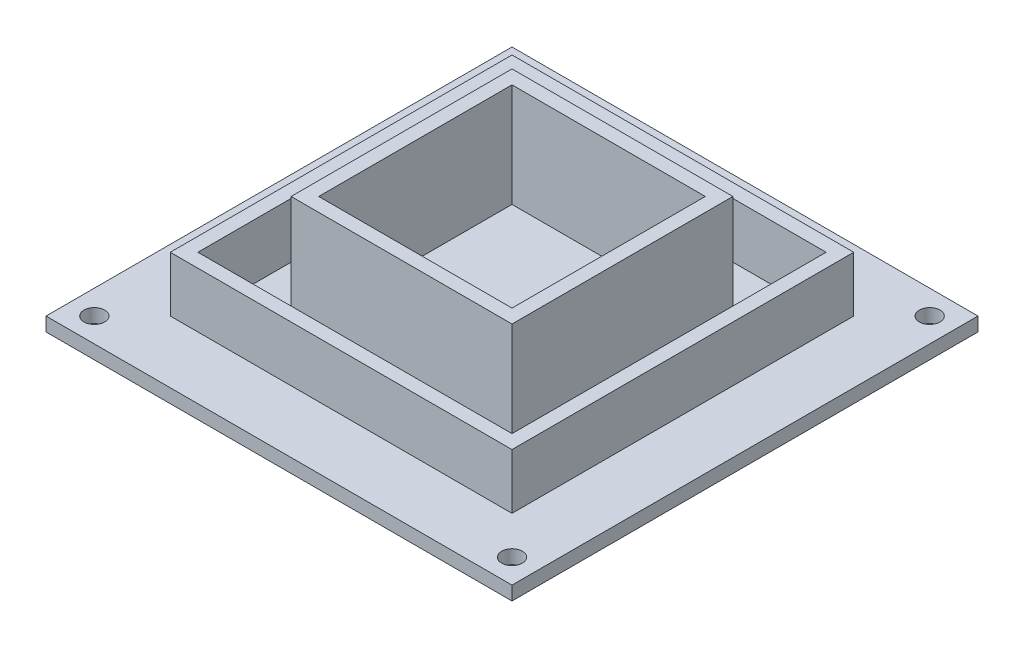
ISO-10303-21;
HEADER;
FILE_DESCRIPTION(('STEP AP214'),'2;1');
FILE_NAME('part.step','',(''),(''),'','','');
FILE_SCHEMA(('AUTOMOTIVE_DESIGN { 1 0 10303 214 1 1 1 1 }'));
ENDSEC;
DATA;
#1=APPLICATION_CONTEXT('core data for automotive mechanical design processes');
#2=APPLICATION_PROTOCOL_DEFINITION('international standard','automotive_design',2000,#1);
#3=PRODUCT_CONTEXT('',#1,'mechanical');
#4=PRODUCT('Part','Part','',(#3));
#5=PRODUCT_RELATED_PRODUCT_CATEGORY('part','',(#4));
#6=PRODUCT_DEFINITION_FORMATION('','',#4);
#7=PRODUCT_DEFINITION_CONTEXT('part definition',#1,'design');
#8=PRODUCT_DEFINITION('design','',#6,#7);
#9=PRODUCT_DEFINITION_SHAPE('','',#8);
#10=(LENGTH_UNIT() NAMED_UNIT(*) SI_UNIT(.MILLI.,.METRE.));
#11=(NAMED_UNIT(*) PLANE_ANGLE_UNIT() SI_UNIT($,.RADIAN.));
#12=(NAMED_UNIT(*) SI_UNIT($,.STERADIAN.) SOLID_ANGLE_UNIT());
#13=UNCERTAINTY_MEASURE_WITH_UNIT(LENGTH_MEASURE(1.E-05),#10,'distance_accuracy_value','');
#14=(GEOMETRIC_REPRESENTATION_CONTEXT(3) GLOBAL_UNCERTAINTY_ASSIGNED_CONTEXT((#13)) GLOBAL_UNIT_ASSIGNED_CONTEXT((#10,
#11,#12)) REPRESENTATION_CONTEXT('',''));
#15=CARTESIAN_POINT('',(0.,0.,0.));
#16=DIRECTION('',(0.,0.,1.));
#17=DIRECTION('',(1.,0.,0.));
#18=AXIS2_PLACEMENT_3D('',#15,#16,#17);
#19=CARTESIAN_POINT('',(0.,2.,0.));
#20=DIRECTION('',(0.,1.,0.));
#21=DIRECTION('',(0.,0.,1.));
#22=AXIS2_PLACEMENT_3D('',#19,#20,#21);
#23=PLANE('',#22);
#24=DIRECTION('',(0.,0.,1.));
#25=VECTOR('',#24,1.);
#26=CARTESIAN_POINT('',(8.69278606965178,2.,0.));
#27=LINE('',#26,#25);
#28=CARTESIAN_POINT('',(8.69278606965177,2.,-5.90671641791045));
#29=VERTEX_POINT('',#28);
#30=CARTESIAN_POINT('',(8.69278606965179,2.,26.0932835820895));
#31=VERTEX_POINT('',#30);
#32=EDGE_CURVE('E279',#29,#31,#27,.T.);
#33=ORIENTED_EDGE('',*,*,#32,.T.);
#34=DIRECTION('',(-1.,0.,0.));
#35=VECTOR('',#34,1.);
#36=CARTESIAN_POINT('',(0.,2.,26.0932835820896));
#37=LINE('',#36,#35);
#38=CARTESIAN_POINT('',(-23.3072139303482,2.,26.0932835820896));
#39=VERTEX_POINT('',#38);
#40=EDGE_CURVE('E281',#31,#39,#37,.T.);
#41=ORIENTED_EDGE('',*,*,#40,.T.);
#42=DIRECTION('',(0.,0.,1.));
#43=VECTOR('',#42,1.);
#44=CARTESIAN_POINT('',(-23.3072139303482,2.,0.));
#45=LINE('',#44,#43);
#46=CARTESIAN_POINT('',(-23.3072139303482,2.,-5.90671641791043));
#47=VERTEX_POINT('',#46);
#48=EDGE_CURVE('E254',#47,#39,#45,.T.);
#49=ORIENTED_EDGE('',*,*,#48,.F.);
#50=DIRECTION('',(-1.,0.,0.));
#51=VECTOR('',#50,1.);
#52=CARTESIAN_POINT('',(0.,2.,-5.90671641791045));
#53=LINE('',#52,#51);
#54=EDGE_CURVE('E276',#29,#47,#53,.T.);
#55=ORIENTED_EDGE('',*,*,#54,.F.);
#56=EDGE_LOOP('',(#33,#41,#49,#55));
#57=FACE_BOUND('',#56,.T.);
#58=DIRECTION('',(0.,0.,1.));
#59=VECTOR('',#58,1.);
#60=CARTESIAN_POINT('',(-30.0572139303482,2.,0.));
#61=LINE('',#60,#59);
#62=CARTESIAN_POINT('',(-30.0572139303482,2.,-12.6567164179104));
#63=VERTEX_POINT('',#62);
#64=CARTESIAN_POINT('',(-30.0572139303482,2.,32.8432835820896));
#65=VERTEX_POINT('',#64);
#66=EDGE_CURVE('E50',#63,#65,#61,.T.);
#67=ORIENTED_EDGE('',*,*,#66,.T.);
#68=DIRECTION('',(1.,0.,0.));
#69=VECTOR('',#68,1.);
#70=CARTESIAN_POINT('',(0.,2.,32.8432835820895));
#71=LINE('',#70,#69);
#72=CARTESIAN_POINT('',(15.4427860696518,2.,32.8432835820895));
#73=VERTEX_POINT('',#72);
#74=EDGE_CURVE('E192',#65,#73,#71,.T.);
#75=ORIENTED_EDGE('',*,*,#74,.T.);
#76=DIRECTION('',(0.,0.,1.));
#77=VECTOR('',#76,1.);
#78=CARTESIAN_POINT('',(15.4427860696518,2.,0.));
#79=LINE('',#78,#77);
#80=CARTESIAN_POINT('',(15.4427860696518,2.,-12.6567164179104));
#81=VERTEX_POINT('',#80);
#82=EDGE_CURVE('E205',#81,#73,#79,.T.);
#83=ORIENTED_EDGE('',*,*,#82,.F.);
#84=DIRECTION('',(1.,0.,0.));
#85=VECTOR('',#84,1.);
#86=CARTESIAN_POINT('',(0.,2.,-12.6567164179104));
#87=LINE('',#86,#85);
#88=EDGE_CURVE('E55',#63,#81,#87,.T.);
#89=ORIENTED_EDGE('',*,*,#88,.F.);
#90=EDGE_LOOP('',(#67,#75,#83,#89));
#91=FACE_BOUND('',#90,.T.);
#92=ADVANCED_FACE('F35',(#57,#91),#23,.T.);
#93=CARTESIAN_POINT('',(0.,17.,26.0932835820896));
#94=DIRECTION('',(0.,0.,-1.));
#95=DIRECTION('',(-1.,0.,0.));
#96=AXIS2_PLACEMENT_3D('',#93,#94,#95);
#97=PLANE('',#96);
#98=ORIENTED_EDGE('',*,*,#40,.F.);
#99=DIRECTION('',(0.,-1.,0.));
#100=VECTOR('',#99,1.);
#101=CARTESIAN_POINT('',(8.69278606965179,17.,26.0932835820895));
#102=LINE('',#101,#100);
#103=CARTESIAN_POINT('',(8.69278606965179,17.,26.0932835820895));
#104=VERTEX_POINT('',#103);
#105=EDGE_CURVE('E251',#104,#31,#102,.T.);
#106=ORIENTED_EDGE('',*,*,#105,.F.);
#107=DIRECTION('',(1.,0.,0.));
#108=VECTOR('',#107,1.);
#109=CARTESIAN_POINT('',(0.,17.,26.0932835820896));
#110=LINE('',#109,#108);
#111=CARTESIAN_POINT('',(-23.3072139303482,17.,26.0932835820896));
#112=VERTEX_POINT('',#111);
#113=EDGE_CURVE('E229',#112,#104,#110,.T.);
#114=ORIENTED_EDGE('',*,*,#113,.F.);
#115=DIRECTION('',(0.,-1.,0.));
#116=VECTOR('',#115,1.);
#117=CARTESIAN_POINT('',(-23.3072139303482,17.,26.0932835820896));
#118=LINE('',#117,#116);
#119=EDGE_CURVE('E241',#112,#39,#118,.T.);
#120=ORIENTED_EDGE('',*,*,#119,.T.);
#121=EDGE_LOOP('',(#98,#106,#114,#120));
#122=FACE_BOUND('',#121,.T.);
#123=ADVANCED_FACE('F417',(#122),#97,.F.);
#124=CARTESIAN_POINT('',(8.69278606965178,17.,0.));
#125=DIRECTION('',(-1.,0.,0.));
#126=DIRECTION('',(0.,0.,1.));
#127=AXIS2_PLACEMENT_3D('',#124,#125,#126);
#128=PLANE('',#127);
#129=ORIENTED_EDGE('',*,*,#32,.F.);
#130=DIRECTION('',(0.,-1.,0.));
#131=VECTOR('',#130,1.);
#132=CARTESIAN_POINT('',(8.69278606965177,17.,-5.90671641791045));
#133=LINE('',#132,#131);
#134=CARTESIAN_POINT('',(8.69278606965177,17.,-5.90671641791045));
#135=VERTEX_POINT('',#134);
#136=EDGE_CURVE('E248',#135,#29,#133,.T.);
#137=ORIENTED_EDGE('',*,*,#136,.F.);
#138=DIRECTION('',(0.,0.,-1.));
#139=VECTOR('',#138,1.);
#140=CARTESIAN_POINT('',(8.69278606965178,17.,0.));
#141=LINE('',#140,#139);
#142=EDGE_CURVE('E232',#104,#135,#141,.T.);
#143=ORIENTED_EDGE('',*,*,#142,.F.);
#144=ORIENTED_EDGE('',*,*,#105,.T.);
#145=EDGE_LOOP('',(#129,#137,#143,#144));
#146=FACE_BOUND('',#145,.T.);
#147=ADVANCED_FACE('F422',(#146),#128,.F.);
#148=CARTESIAN_POINT('',(0.,17.,-5.90671641791045));
#149=DIRECTION('',(0.,0.,-1.));
#150=DIRECTION('',(-1.,0.,0.));
#151=AXIS2_PLACEMENT_3D('',#148,#149,#150);
#152=PLANE('',#151);
#153=ORIENTED_EDGE('',*,*,#136,.T.);
#154=ORIENTED_EDGE('',*,*,#54,.T.);
#155=DIRECTION('',(0.,-1.,0.));
#156=VECTOR('',#155,1.);
#157=CARTESIAN_POINT('',(-23.3072139303482,17.,-5.90671641791043));
#158=LINE('',#157,#156);
#159=CARTESIAN_POINT('',(-23.3072139303482,17.,-5.90671641791043));
#160=VERTEX_POINT('',#159);
#161=EDGE_CURVE('E244',#160,#47,#158,.T.);
#162=ORIENTED_EDGE('',*,*,#161,.F.);
#163=DIRECTION('',(1.,0.,0.));
#164=VECTOR('',#163,1.);
#165=CARTESIAN_POINT('',(0.,17.,-5.90671641791045));
#166=LINE('',#165,#164);
#167=EDGE_CURVE('E234',#160,#135,#166,.T.);
#168=ORIENTED_EDGE('',*,*,#167,.T.);
#169=EDGE_LOOP('',(#153,#154,#162,#168));
#170=FACE_BOUND('',#169,.T.);
#171=ADVANCED_FACE('F464',(#170),#152,.T.);
#172=CARTESIAN_POINT('',(6.69278606965177,17.,0.));
#173=DIRECTION('',(-1.,0.,0.));
#174=DIRECTION('',(0.,0.,1.));
#175=AXIS2_PLACEMENT_3D('',#172,#173,#174);
#176=PLANE('',#175);
#177=DIRECTION('',(0.,-1.,0.));
#178=VECTOR('',#177,1.);
#179=CARTESIAN_POINT('',(6.69278606965177,17.,-3.90671641791045));
#180=LINE('',#179,#178);
#181=CARTESIAN_POINT('',(6.69278606965177,17.,-3.90671641791045));
#182=VERTEX_POINT('',#181);
#183=CARTESIAN_POINT('',(6.69278606965177,2.,-3.90671641791045));
#184=VERTEX_POINT('',#183);
#185=EDGE_CURVE('E240',#182,#184,#180,.T.);
#186=ORIENTED_EDGE('',*,*,#185,.T.);
#187=DIRECTION('',(0.,0.,1.));
#188=VECTOR('',#187,1.);
#189=CARTESIAN_POINT('',(6.69278606965177,2.,0.));
#190=LINE('',#189,#188);
#191=CARTESIAN_POINT('',(6.69278606965177,2.,24.0932835820896));
#192=VERTEX_POINT('',#191);
#193=EDGE_CURVE('E274',#184,#192,#190,.T.);
#194=ORIENTED_EDGE('',*,*,#193,.T.);
#195=DIRECTION('',(0.,-1.,0.));
#196=VECTOR('',#195,1.);
#197=CARTESIAN_POINT('',(6.69278606965177,17.,24.0932835820896));
#198=LINE('',#197,#196);
#199=CARTESIAN_POINT('',(6.69278606965177,17.,24.0932835820896));
#200=VERTEX_POINT('',#199);
#201=EDGE_CURVE('E245',#200,#192,#198,.T.);
#202=ORIENTED_EDGE('',*,*,#201,.F.);
#203=DIRECTION('',(0.,0.,-1.));
#204=VECTOR('',#203,1.);
#205=CARTESIAN_POINT('',(6.69278606965177,17.,0.));
#206=LINE('',#205,#204);
#207=EDGE_CURVE('E219',#200,#182,#206,.T.);
#208=ORIENTED_EDGE('',*,*,#207,.T.);
#209=EDGE_LOOP('',(#186,#194,#202,#208));
#210=FACE_BOUND('',#209,.T.);
#211=ADVANCED_FACE('F440',(#210),#176,.T.);
#212=CARTESIAN_POINT('',(0.,17.,24.0932835820896));
#213=DIRECTION('',(0.,0.,-1.));
#214=DIRECTION('',(-1.,0.,0.));
#215=AXIS2_PLACEMENT_3D('',#212,#213,#214);
#216=PLANE('',#215);
#217=ORIENTED_EDGE('',*,*,#201,.T.);
#218=DIRECTION('',(-1.,0.,0.));
#219=VECTOR('',#218,1.);
#220=CARTESIAN_POINT('',(0.,2.,24.0932835820896));
#221=LINE('',#220,#219);
#222=CARTESIAN_POINT('',(-21.3072139303482,2.,24.0932835820896));
#223=VERTEX_POINT('',#222);
#224=EDGE_CURVE('E272',#192,#223,#221,.T.);
#225=ORIENTED_EDGE('',*,*,#224,.T.);
#226=DIRECTION('',(0.,-1.,0.));
#227=VECTOR('',#226,1.);
#228=CARTESIAN_POINT('',(-21.3072139303482,17.,24.0932835820896));
#229=LINE('',#228,#227);
#230=CARTESIAN_POINT('',(-21.3072139303482,17.,24.0932835820896));
#231=VERTEX_POINT('',#230);
#232=EDGE_CURVE('E259',#231,#223,#229,.T.);
#233=ORIENTED_EDGE('',*,*,#232,.F.);
#234=DIRECTION('',(1.,0.,0.));
#235=VECTOR('',#234,1.);
#236=CARTESIAN_POINT('',(0.,17.,24.0932835820896));
#237=LINE('',#236,#235);
#238=EDGE_CURVE('E222',#231,#200,#237,.T.);
#239=ORIENTED_EDGE('',*,*,#238,.T.);
#240=EDGE_LOOP('',(#217,#225,#233,#239));
#241=FACE_BOUND('',#240,.T.);
#242=ADVANCED_FACE('F444',(#241),#216,.T.);
#243=CARTESIAN_POINT('',(-21.3072139303482,17.,0.));
#244=DIRECTION('',(-1.,0.,0.));
#245=DIRECTION('',(0.,0.,1.));
#246=AXIS2_PLACEMENT_3D('',#243,#244,#245);
#247=PLANE('',#246);
#248=DIRECTION('',(0.,0.,1.));
#249=VECTOR('',#248,1.);
#250=CARTESIAN_POINT('',(-21.3072139303482,2.,0.));
#251=LINE('',#250,#249);
#252=CARTESIAN_POINT('',(-21.3072139303482,2.,-3.90671641791045));
#253=VERTEX_POINT('',#252);
#254=EDGE_CURVE('E269',#253,#223,#251,.T.);
#255=ORIENTED_EDGE('',*,*,#254,.F.);
#256=DIRECTION('',(0.,-1.,0.));
#257=VECTOR('',#256,1.);
#258=CARTESIAN_POINT('',(-21.3072139303482,17.,-3.90671641791045));
#259=LINE('',#258,#257);
#260=CARTESIAN_POINT('',(-21.3072139303482,17.,-3.90671641791045));
#261=VERTEX_POINT('',#260);
#262=EDGE_CURVE('E257',#261,#253,#259,.T.);
#263=ORIENTED_EDGE('',*,*,#262,.F.);
#264=DIRECTION('',(0.,0.,-1.));
#265=VECTOR('',#264,1.);
#266=CARTESIAN_POINT('',(-21.3072139303482,17.,0.));
#267=LINE('',#266,#265);
#268=EDGE_CURVE('E225',#231,#261,#267,.T.);
#269=ORIENTED_EDGE('',*,*,#268,.F.);
#270=ORIENTED_EDGE('',*,*,#232,.T.);
#271=EDGE_LOOP('',(#255,#263,#269,#270));
#272=FACE_BOUND('',#271,.T.);
#273=ADVANCED_FACE('F454',(#272),#247,.F.);
#274=CARTESIAN_POINT('',(0.,17.,-3.90671641791045));
#275=DIRECTION('',(0.,0.,-1.));
#276=DIRECTION('',(-1.,0.,0.));
#277=AXIS2_PLACEMENT_3D('',#274,#275,#276);
#278=PLANE('',#277);
#279=DIRECTION('',(-1.,0.,0.));
#280=VECTOR('',#279,1.);
#281=CARTESIAN_POINT('',(0.,2.,-3.90671641791045));
#282=LINE('',#281,#280);
#283=EDGE_CURVE('E266',#184,#253,#282,.T.);
#284=ORIENTED_EDGE('',*,*,#283,.F.);
#285=ORIENTED_EDGE('',*,*,#185,.F.);
#286=DIRECTION('',(1.,0.,0.));
#287=VECTOR('',#286,1.);
#288=CARTESIAN_POINT('',(0.,17.,-3.90671641791045));
#289=LINE('',#288,#287);
#290=EDGE_CURVE('E227',#261,#182,#289,.T.);
#291=ORIENTED_EDGE('',*,*,#290,.F.);
#292=ORIENTED_EDGE('',*,*,#262,.T.);
#293=EDGE_LOOP('',(#284,#285,#291,#292));
#294=FACE_BOUND('',#293,.T.);
#295=ADVANCED_FACE('F451',(#294),#278,.F.);
#296=CARTESIAN_POINT('',(-23.3072139303482,17.,0.));
#297=DIRECTION('',(-1.,0.,0.));
#298=DIRECTION('',(0.,0.,1.));
#299=AXIS2_PLACEMENT_3D('',#296,#297,#298);
#300=PLANE('',#299);
#301=ORIENTED_EDGE('',*,*,#161,.T.);
#302=ORIENTED_EDGE('',*,*,#48,.T.);
#303=ORIENTED_EDGE('',*,*,#119,.F.);
#304=DIRECTION('',(0.,0.,-1.));
#305=VECTOR('',#304,1.);
#306=CARTESIAN_POINT('',(-23.3072139303482,17.,0.));
#307=LINE('',#306,#305);
#308=EDGE_CURVE('E237',#112,#160,#307,.T.);
#309=ORIENTED_EDGE('',*,*,#308,.T.);
#310=EDGE_LOOP('',(#301,#302,#303,#309));
#311=FACE_BOUND('',#310,.T.);
#312=ADVANCED_FACE('F434',(#311),#300,.T.);
#313=CARTESIAN_POINT('',(0.,17.,0.));
#314=DIRECTION('',(0.,1.,0.));
#315=DIRECTION('',(0.,0.,1.));
#316=AXIS2_PLACEMENT_3D('',#313,#314,#315);
#317=PLANE('',#316);
#318=ORIENTED_EDGE('',*,*,#207,.F.);
#319=ORIENTED_EDGE('',*,*,#238,.F.);
#320=ORIENTED_EDGE('',*,*,#268,.T.);
#321=ORIENTED_EDGE('',*,*,#290,.T.);
#322=EDGE_LOOP('',(#318,#319,#320,#321));
#323=FACE_BOUND('',#322,.T.);
#324=ORIENTED_EDGE('',*,*,#113,.T.);
#325=ORIENTED_EDGE('',*,*,#142,.T.);
#326=ORIENTED_EDGE('',*,*,#167,.F.);
#327=ORIENTED_EDGE('',*,*,#308,.F.);
#328=EDGE_LOOP('',(#324,#325,#326,#327));
#329=FACE_BOUND('',#328,.T.);
#330=ADVANCED_FACE('F427',(#323,#329),#317,.T.);
#331=ORIENTED_EDGE('',*,*,#193,.F.);
#332=ORIENTED_EDGE('',*,*,#283,.T.);
#333=ORIENTED_EDGE('',*,*,#254,.T.);
#334=ORIENTED_EDGE('',*,*,#224,.F.);
#335=EDGE_LOOP('',(#331,#332,#333,#334));
#336=FACE_BOUND('',#335,.T.);
#337=ADVANCED_FACE('F360',(#336),#23,.T.);
#338=CARTESIAN_POINT('',(0.,10.,34.8432835820896));
#339=DIRECTION('',(0.,0.,-1.));
#340=DIRECTION('',(-1.,0.,0.));
#341=AXIS2_PLACEMENT_3D('',#338,#339,#340);
#342=PLANE('',#341);
#343=DIRECTION('',(-1.,0.,0.));
#344=VECTOR('',#343,1.);
#345=CARTESIAN_POINT('',(0.,2.,34.8432835820896));
#346=LINE('',#345,#344);
#347=CARTESIAN_POINT('',(17.4427860696518,2.,34.8432835820896));
#348=VERTEX_POINT('',#347);
#349=CARTESIAN_POINT('',(-32.0572139303482,2.,34.8432835820896));
#350=VERTEX_POINT('',#349);
#351=EDGE_CURVE('E217',#348,#350,#346,.T.);
#352=ORIENTED_EDGE('',*,*,#351,.F.);
#353=DIRECTION('',(0.,-1.,0.));
#354=VECTOR('',#353,1.);
#355=CARTESIAN_POINT('',(17.4427860696518,10.,34.8432835820896));
#356=LINE('',#355,#354);
#357=CARTESIAN_POINT('',(17.4427860696518,10.,34.8432835820896));
#358=VERTEX_POINT('',#357);
#359=EDGE_CURVE('E206',#358,#348,#356,.T.);
#360=ORIENTED_EDGE('',*,*,#359,.F.);
#361=DIRECTION('',(1.,0.,0.));
#362=VECTOR('',#361,1.);
#363=CARTESIAN_POINT('',(0.,10.,34.8432835820896));
#364=LINE('',#363,#362);
#365=CARTESIAN_POINT('',(-32.0572139303482,10.,34.8432835820896));
#366=VERTEX_POINT('',#365);
#367=EDGE_CURVE('E391',#366,#358,#364,.T.);
#368=ORIENTED_EDGE('',*,*,#367,.F.);
#369=DIRECTION('',(0.,-1.,0.));
#370=VECTOR('',#369,1.);
#371=CARTESIAN_POINT('',(-32.0572139303482,10.,34.8432835820896));
#372=LINE('',#371,#370);
#373=EDGE_CURVE('E193',#366,#350,#372,.T.);
#374=ORIENTED_EDGE('',*,*,#373,.T.);
#375=EDGE_LOOP('',(#352,#360,#368,#374));
#376=FACE_BOUND('',#375,.T.);
#377=ADVANCED_FACE('F373',(#376),#342,.F.);
#378=CARTESIAN_POINT('',(17.4427860696518,10.,0.));
#379=DIRECTION('',(-1.,0.,0.));
#380=DIRECTION('',(0.,0.,1.));
#381=AXIS2_PLACEMENT_3D('',#378,#379,#380);
#382=PLANE('',#381);
#383=DIRECTION('',(0.,0.,1.));
#384=VECTOR('',#383,1.);
#385=CARTESIAN_POINT('',(17.4427860696518,2.,0.));
#386=LINE('',#385,#384);
#387=CARTESIAN_POINT('',(17.4427860696518,2.,-14.6567164179105));
#388=VERTEX_POINT('',#387);
#389=EDGE_CURVE('E215',#388,#348,#386,.T.);
#390=ORIENTED_EDGE('',*,*,#389,.F.);
#391=DIRECTION('',(0.,-1.,0.));
#392=VECTOR('',#391,1.);
#393=CARTESIAN_POINT('',(17.4427860696518,10.,-14.6567164179105));
#394=LINE('',#393,#392);
#395=CARTESIAN_POINT('',(17.4427860696518,10.,-14.6567164179105));
#396=VERTEX_POINT('',#395);
#397=EDGE_CURVE('E378',#396,#388,#394,.T.);
#398=ORIENTED_EDGE('',*,*,#397,.F.);
#399=DIRECTION('',(0.,0.,-1.));
#400=VECTOR('',#399,1.);
#401=CARTESIAN_POINT('',(17.4427860696518,10.,0.));
#402=LINE('',#401,#400);
#403=EDGE_CURVE('E376',#358,#396,#402,.T.);
#404=ORIENTED_EDGE('',*,*,#403,.F.);
#405=ORIENTED_EDGE('',*,*,#359,.T.);
#406=EDGE_LOOP('',(#390,#398,#404,#405));
#407=FACE_BOUND('',#406,.T.);
#408=ADVANCED_FACE('F375',(#407),#382,.F.);
#409=CARTESIAN_POINT('',(0.,10.,-14.6567164179105));
#410=DIRECTION('',(0.,0.,-1.));
#411=DIRECTION('',(-1.,0.,0.));
#412=AXIS2_PLACEMENT_3D('',#409,#410,#411);
#413=PLANE('',#412);
#414=ORIENTED_EDGE('',*,*,#397,.T.);
#415=DIRECTION('',(-1.,0.,0.));
#416=VECTOR('',#415,1.);
#417=CARTESIAN_POINT('',(0.,2.,-14.6567164179105));
#418=LINE('',#417,#416);
#419=CARTESIAN_POINT('',(-32.0572139303482,2.,-14.6567164179105));
#420=VERTEX_POINT('',#419);
#421=EDGE_CURVE('E212',#388,#420,#418,.T.);
#422=ORIENTED_EDGE('',*,*,#421,.T.);
#423=DIRECTION('',(0.,-1.,0.));
#424=VECTOR('',#423,1.);
#425=CARTESIAN_POINT('',(-32.0572139303482,10.,-14.6567164179105));
#426=LINE('',#425,#424);
#427=CARTESIAN_POINT('',(-32.0572139303482,10.,-14.6567164179105));
#428=VERTEX_POINT('',#427);
#429=EDGE_CURVE('E196',#428,#420,#426,.T.);
#430=ORIENTED_EDGE('',*,*,#429,.F.);
#431=DIRECTION('',(1.,0.,0.));
#432=VECTOR('',#431,1.);
#433=CARTESIAN_POINT('',(0.,10.,-14.6567164179105));
#434=LINE('',#433,#432);
#435=EDGE_CURVE('E396',#428,#396,#434,.T.);
#436=ORIENTED_EDGE('',*,*,#435,.T.);
#437=EDGE_LOOP('',(#414,#422,#430,#436));
#438=FACE_BOUND('',#437,.T.);
#439=ADVANCED_FACE('F406',(#438),#413,.T.);
#440=CARTESIAN_POINT('',(0.,10.,32.8432835820895));
#441=DIRECTION('',(0.,0.,1.));
#442=DIRECTION('',(1.,0.,0.));
#443=AXIS2_PLACEMENT_3D('',#440,#441,#442);
#444=PLANE('',#443);
#445=ORIENTED_EDGE('',*,*,#74,.F.);
#446=DIRECTION('',(0.,-1.,0.));
#447=VECTOR('',#446,1.);
#448=CARTESIAN_POINT('',(-30.0572139303482,10.,32.8432835820896));
#449=LINE('',#448,#447);
#450=CARTESIAN_POINT('',(-30.0572139303482,10.,32.8432835820896));
#451=VERTEX_POINT('',#450);
#452=EDGE_CURVE('E173',#451,#65,#449,.T.);
#453=ORIENTED_EDGE('',*,*,#452,.F.);
#454=DIRECTION('',(-1.,0.,0.));
#455=VECTOR('',#454,1.);
#456=CARTESIAN_POINT('',(0.,10.,32.8432835820895));
#457=LINE('',#456,#455);
#458=CARTESIAN_POINT('',(15.4427860696518,10.,32.8432835820895));
#459=VERTEX_POINT('',#458);
#460=EDGE_CURVE('E180',#459,#451,#457,.T.);
#461=ORIENTED_EDGE('',*,*,#460,.F.);
#462=DIRECTION('',(0.,-1.,0.));
#463=VECTOR('',#462,1.);
#464=CARTESIAN_POINT('',(15.4427860696518,10.,32.8432835820895));
#465=LINE('',#464,#463);
#466=EDGE_CURVE('E383',#459,#73,#465,.T.);
#467=ORIENTED_EDGE('',*,*,#466,.T.);
#468=EDGE_LOOP('',(#445,#453,#461,#467));
#469=FACE_BOUND('',#468,.T.);
#470=ADVANCED_FACE('F191',(#469),#444,.F.);
#471=CARTESIAN_POINT('',(-30.0572139303482,10.,0.));
#472=DIRECTION('',(-1.,0.,0.));
#473=DIRECTION('',(0.,0.,1.));
#474=AXIS2_PLACEMENT_3D('',#471,#472,#473);
#475=PLANE('',#474);
#476=ORIENTED_EDGE('',*,*,#66,.F.);
#477=DIRECTION('',(0.,-1.,0.));
#478=VECTOR('',#477,1.);
#479=CARTESIAN_POINT('',(-30.0572139303482,10.,-12.6567164179104));
#480=LINE('',#479,#478);
#481=CARTESIAN_POINT('',(-30.0572139303482,10.,-12.6567164179104));
#482=VERTEX_POINT('',#481);
#483=EDGE_CURVE('E175',#482,#63,#480,.T.);
#484=ORIENTED_EDGE('',*,*,#483,.F.);
#485=DIRECTION('',(0.,0.,-1.));
#486=VECTOR('',#485,1.);
#487=CARTESIAN_POINT('',(-30.0572139303482,10.,0.));
#488=LINE('',#487,#486);
#489=EDGE_CURVE('E169',#451,#482,#488,.T.);
#490=ORIENTED_EDGE('',*,*,#489,.F.);
#491=ORIENTED_EDGE('',*,*,#452,.T.);
#492=EDGE_LOOP('',(#476,#484,#490,#491));
#493=FACE_BOUND('',#492,.T.);
#494=ADVANCED_FACE('F171',(#493),#475,.F.);
#495=CARTESIAN_POINT('',(0.,10.,-12.6567164179104));
#496=DIRECTION('',(0.,0.,1.));
#497=DIRECTION('',(1.,0.,0.));
#498=AXIS2_PLACEMENT_3D('',#495,#496,#497);
#499=PLANE('',#498);
#500=ORIENTED_EDGE('',*,*,#483,.T.);
#501=ORIENTED_EDGE('',*,*,#88,.T.);
#502=DIRECTION('',(0.,-1.,0.));
#503=VECTOR('',#502,1.);
#504=CARTESIAN_POINT('',(15.4427860696518,10.,-12.6567164179104));
#505=LINE('',#504,#503);
#506=CARTESIAN_POINT('',(15.4427860696518,10.,-12.6567164179104));
#507=VERTEX_POINT('',#506);
#508=EDGE_CURVE('E198',#507,#81,#505,.T.);
#509=ORIENTED_EDGE('',*,*,#508,.F.);
#510=DIRECTION('',(-1.,0.,0.));
#511=VECTOR('',#510,1.);
#512=CARTESIAN_POINT('',(0.,10.,-12.6567164179104));
#513=LINE('',#512,#511);
#514=EDGE_CURVE('E179',#507,#482,#513,.T.);
#515=ORIENTED_EDGE('',*,*,#514,.T.);
#516=EDGE_LOOP('',(#500,#501,#509,#515));
#517=FACE_BOUND('',#516,.T.);
#518=ADVANCED_FACE('F389',(#517),#499,.T.);
#519=CARTESIAN_POINT('',(15.4427860696518,10.,0.));
#520=DIRECTION('',(-1.,0.,0.));
#521=DIRECTION('',(0.,0.,1.));
#522=AXIS2_PLACEMENT_3D('',#519,#520,#521);
#523=PLANE('',#522);
#524=ORIENTED_EDGE('',*,*,#508,.T.);
#525=ORIENTED_EDGE('',*,*,#82,.T.);
#526=ORIENTED_EDGE('',*,*,#466,.F.);
#527=DIRECTION('',(0.,0.,-1.));
#528=VECTOR('',#527,1.);
#529=CARTESIAN_POINT('',(15.4427860696518,10.,0.));
#530=LINE('',#529,#528);
#531=EDGE_CURVE('E187',#459,#507,#530,.T.);
#532=ORIENTED_EDGE('',*,*,#531,.T.);
#533=EDGE_LOOP('',(#524,#525,#526,#532));
#534=FACE_BOUND('',#533,.T.);
#535=ADVANCED_FACE('F387',(#534),#523,.T.);
#536=CARTESIAN_POINT('',(-32.0572139303482,10.,0.));
#537=DIRECTION('',(-1.,0.,0.));
#538=DIRECTION('',(0.,0.,1.));
#539=AXIS2_PLACEMENT_3D('',#536,#537,#538);
#540=PLANE('',#539);
#541=ORIENTED_EDGE('',*,*,#429,.T.);
#542=DIRECTION('',(0.,0.,1.));
#543=VECTOR('',#542,1.);
#544=CARTESIAN_POINT('',(-32.0572139303482,2.,0.));
#545=LINE('',#544,#543);
#546=EDGE_CURVE('E202',#420,#350,#545,.T.);
#547=ORIENTED_EDGE('',*,*,#546,.T.);
#548=ORIENTED_EDGE('',*,*,#373,.F.);
#549=DIRECTION('',(0.,0.,-1.));
#550=VECTOR('',#549,1.);
#551=CARTESIAN_POINT('',(-32.0572139303482,10.,0.));
#552=LINE('',#551,#550);
#553=EDGE_CURVE('E384',#366,#428,#552,.T.);
#554=ORIENTED_EDGE('',*,*,#553,.T.);
#555=EDGE_LOOP('',(#541,#547,#548,#554));
#556=FACE_BOUND('',#555,.T.);
#557=ADVANCED_FACE('F402',(#556),#540,.T.);
#558=CARTESIAN_POINT('',(0.,10.,0.));
#559=DIRECTION('',(0.,1.,0.));
#560=DIRECTION('',(0.,0.,1.));
#561=AXIS2_PLACEMENT_3D('',#558,#559,#560);
#562=PLANE('',#561);
#563=ORIENTED_EDGE('',*,*,#460,.T.);
#564=ORIENTED_EDGE('',*,*,#489,.T.);
#565=ORIENTED_EDGE('',*,*,#514,.F.);
#566=ORIENTED_EDGE('',*,*,#531,.F.);
#567=EDGE_LOOP('',(#563,#564,#565,#566));
#568=FACE_BOUND('',#567,.T.);
#569=ORIENTED_EDGE('',*,*,#367,.T.);
#570=ORIENTED_EDGE('',*,*,#403,.T.);
#571=ORIENTED_EDGE('',*,*,#435,.F.);
#572=ORIENTED_EDGE('',*,*,#553,.F.);
#573=EDGE_LOOP('',(#569,#570,#571,#572));
#574=FACE_BOUND('',#573,.T.);
#575=ADVANCED_FACE('F184',(#568,#574),#562,.T.);
#576=CARTESIAN_POINT('',(0.,0.,0.));
#577=DIRECTION('',(0.,1.,0.));
#578=DIRECTION('',(0.,0.,1.));
#579=AXIS2_PLACEMENT_3D('',#576,#577,#578);
#580=PLANE('',#579);
#581=CARTESIAN_POINT('',(22.9427860696518,0.,-20.1567164179104));
#582=DIRECTION('',(0.,1.,0.));
#583=DIRECTION('',(0.,0.,1.));
#584=AXIS2_PLACEMENT_3D('',#581,#582,#583);
#585=CIRCLE('',#584,1.5);
#586=CARTESIAN_POINT('',(22.9427860696518,0.,-18.6567164179104));
#587=VERTEX_POINT('',#586);
#588=EDGE_CURVE('E283',#587,#587,#585,.F.);
#589=ORIENTED_EDGE('',*,*,#588,.F.);
#590=EDGE_LOOP('',(#589));
#591=FACE_BOUND('',#590,.T.);
#592=CARTESIAN_POINT('',(-37.5572139303482,0.,-20.1567164179104));
#593=DIRECTION('',(0.,1.,0.));
#594=DIRECTION('',(0.,0.,1.));
#595=AXIS2_PLACEMENT_3D('',#592,#593,#594);
#596=CIRCLE('',#595,1.5);
#597=CARTESIAN_POINT('',(-37.5572139303482,0.,-18.6567164179104));
#598=VERTEX_POINT('',#597);
#599=EDGE_CURVE('E311',#598,#598,#596,.T.);
#600=ORIENTED_EDGE('',*,*,#599,.T.);
#601=EDGE_LOOP('',(#600));
#602=FACE_BOUND('',#601,.T.);
#603=DIRECTION('',(0.,0.,-1.));
#604=VECTOR('',#603,1.);
#605=CARTESIAN_POINT('',(-41.0572139303482,0.,0.));
#606=LINE('',#605,#604);
#607=CARTESIAN_POINT('',(-41.0572139303482,0.,43.8432835820896));
#608=VERTEX_POINT('',#607);
#609=CARTESIAN_POINT('',(-41.0572139303482,0.,-23.6567164179104));
#610=VERTEX_POINT('',#609);
#611=EDGE_CURVE('E314',#608,#610,#606,.T.);
#612=ORIENTED_EDGE('',*,*,#611,.T.);
#613=DIRECTION('',(-1.,0.,0.));
#614=VECTOR('',#613,1.);
#615=CARTESIAN_POINT('',(0.,0.,-23.6567164179105));
#616=LINE('',#615,#614);
#617=CARTESIAN_POINT('',(26.4427860696518,0.,-23.6567164179105));
#618=VERTEX_POINT('',#617);
#619=EDGE_CURVE('E323',#618,#610,#616,.T.);
#620=ORIENTED_EDGE('',*,*,#619,.F.);
#621=DIRECTION('',(0.,0.,-1.));
#622=VECTOR('',#621,1.);
#623=CARTESIAN_POINT('',(26.4427860696518,0.,0.));
#624=LINE('',#623,#622);
#625=CARTESIAN_POINT('',(26.4427860696518,0.,43.8432835820896));
#626=VERTEX_POINT('',#625);
#627=EDGE_CURVE('E320',#626,#618,#624,.T.);
#628=ORIENTED_EDGE('',*,*,#627,.F.);
#629=DIRECTION('',(-1.,0.,0.));
#630=VECTOR('',#629,1.);
#631=CARTESIAN_POINT('',(0.,0.,43.8432835820896));
#632=LINE('',#631,#630);
#633=EDGE_CURVE('E317',#626,#608,#632,.T.);
#634=ORIENTED_EDGE('',*,*,#633,.T.);
#635=EDGE_LOOP('',(#612,#620,#628,#634));
#636=FACE_BOUND('',#635,.T.);
#637=CARTESIAN_POINT('',(22.9427860696518,0.,40.3432835820895));
#638=DIRECTION('',(0.,1.,0.));
#639=DIRECTION('',(0.,0.,1.));
#640=AXIS2_PLACEMENT_3D('',#637,#638,#639);
#641=CIRCLE('',#640,1.5);
#642=CARTESIAN_POINT('',(22.9427860696518,0.,41.8432835820895));
#643=VERTEX_POINT('',#642);
#644=EDGE_CURVE('E326',#643,#643,#641,.T.);
#645=ORIENTED_EDGE('',*,*,#644,.T.);
#646=EDGE_LOOP('',(#645));
#647=FACE_BOUND('',#646,.T.);
#648=CARTESIAN_POINT('',(-37.5572139303482,0.,40.3432835820895));
#649=DIRECTION('',(0.,1.,0.));
#650=DIRECTION('',(0.,0.,1.));
#651=AXIS2_PLACEMENT_3D('',#648,#649,#650);
#652=CIRCLE('',#651,1.5);
#653=CARTESIAN_POINT('',(-37.5572139303482,0.,41.8432835820895));
#654=VERTEX_POINT('',#653);
#655=EDGE_CURVE('E288',#654,#654,#652,.F.);
#656=ORIENTED_EDGE('',*,*,#655,.F.);
#657=EDGE_LOOP('',(#656));
#658=FACE_BOUND('',#657,.T.);
#659=ADVANCED_FACE('F343',(#591,#602,#636,#647,#658),#580,.F.);
#660=CARTESIAN_POINT('',(22.9427860696518,2.,-20.1567164179104));
#661=DIRECTION('',(0.,-1.,0.));
#662=DIRECTION('',(0.,0.,-1.));
#663=AXIS2_PLACEMENT_3D('',#660,#661,#662);
#664=CYLINDRICAL_SURFACE('',#663,1.5);
#665=CARTESIAN_POINT('',(22.9427860696518,2.,-20.1567164179104));
#666=DIRECTION('',(0.,1.,0.));
#667=DIRECTION('',(0.,0.,1.));
#668=AXIS2_PLACEMENT_3D('',#665,#666,#667);
#669=CIRCLE('',#668,1.5);
#670=CARTESIAN_POINT('',(22.9427860696518,2.,-18.6567164179104));
#671=VERTEX_POINT('',#670);
#672=EDGE_CURVE('E284',#671,#671,#669,.F.);
#673=ORIENTED_EDGE('',*,*,#672,.F.);
#674=EDGE_LOOP('',(#673));
#675=FACE_BOUND('',#674,.T.);
#676=ORIENTED_EDGE('',*,*,#588,.T.);
#677=EDGE_LOOP('',(#676));
#678=FACE_BOUND('',#677,.T.);
#679=ADVANCED_FACE('F37',(#675,#678),#664,.F.);
#680=CARTESIAN_POINT('',(-37.5572139303482,2.,-20.1567164179104));
#681=DIRECTION('',(0.,-1.,0.));
#682=DIRECTION('',(0.,0.,-1.));
#683=AXIS2_PLACEMENT_3D('',#680,#681,#682);
#684=CYLINDRICAL_SURFACE('',#683,1.5);
#685=CARTESIAN_POINT('',(-37.5572139303482,2.,-20.1567164179104));
#686=DIRECTION('',(0.,1.,0.));
#687=DIRECTION('',(0.,0.,1.));
#688=AXIS2_PLACEMENT_3D('',#685,#686,#687);
#689=CIRCLE('',#688,1.5);
#690=CARTESIAN_POINT('',(-37.5572139303482,2.,-18.6567164179104));
#691=VERTEX_POINT('',#690);
#692=EDGE_CURVE('E287',#691,#691,#689,.T.);
#693=ORIENTED_EDGE('',*,*,#692,.T.);
#694=EDGE_LOOP('',(#693));
#695=FACE_BOUND('',#694,.T.);
#696=ORIENTED_EDGE('',*,*,#599,.F.);
#697=EDGE_LOOP('',(#696));
#698=FACE_BOUND('',#697,.T.);
#699=ADVANCED_FACE('F578',(#695,#698),#684,.F.);
#700=CARTESIAN_POINT('',(0.,2.,-23.6567164179105));
#701=DIRECTION('',(0.,0.,1.));
#702=DIRECTION('',(1.,0.,0.));
#703=AXIS2_PLACEMENT_3D('',#700,#701,#702);
#704=PLANE('',#703);
#705=ORIENTED_EDGE('',*,*,#619,.T.);
#706=DIRECTION('',(0.,-1.,0.));
#707=VECTOR('',#706,1.);
#708=CARTESIAN_POINT('',(-41.0572139303482,2.,-23.6567164179104));
#709=LINE('',#708,#707);
#710=CARTESIAN_POINT('',(-41.0572139303482,2.,-23.6567164179104));
#711=VERTEX_POINT('',#710);
#712=EDGE_CURVE('E308',#711,#610,#709,.T.);
#713=ORIENTED_EDGE('',*,*,#712,.F.);
#714=DIRECTION('',(-1.,0.,0.));
#715=VECTOR('',#714,1.);
#716=CARTESIAN_POINT('',(0.,2.,-23.6567164179105));
#717=LINE('',#716,#715);
#718=CARTESIAN_POINT('',(26.4427860696518,2.,-23.6567164179105));
#719=VERTEX_POINT('',#718);
#720=EDGE_CURVE('E300',#719,#711,#717,.T.);
#721=ORIENTED_EDGE('',*,*,#720,.F.);
#722=DIRECTION('',(0.,-1.,0.));
#723=VECTOR('',#722,1.);
#724=CARTESIAN_POINT('',(26.4427860696518,2.,-23.6567164179105));
#725=LINE('',#724,#723);
#726=EDGE_CURVE('E332',#719,#618,#725,.T.);
#727=ORIENTED_EDGE('',*,*,#726,.T.);
#728=EDGE_LOOP('',(#705,#713,#721,#727));
#729=FACE_BOUND('',#728,.T.);
#730=ADVANCED_FACE('F352',(#729),#704,.F.);
#731=CARTESIAN_POINT('',(26.4427860696518,2.,0.));
#732=DIRECTION('',(-1.,0.,0.));
#733=DIRECTION('',(0.,0.,1.));
#734=AXIS2_PLACEMENT_3D('',#731,#732,#733);
#735=PLANE('',#734);
#736=ORIENTED_EDGE('',*,*,#627,.T.);
#737=ORIENTED_EDGE('',*,*,#726,.F.);
#738=DIRECTION('',(0.,0.,-1.));
#739=VECTOR('',#738,1.);
#740=CARTESIAN_POINT('',(26.4427860696518,2.,0.));
#741=LINE('',#740,#739);
#742=CARTESIAN_POINT('',(26.4427860696518,2.,43.8432835820896));
#743=VERTEX_POINT('',#742);
#744=EDGE_CURVE('E297',#743,#719,#741,.T.);
#745=ORIENTED_EDGE('',*,*,#744,.F.);
#746=DIRECTION('',(0.,-1.,0.));
#747=VECTOR('',#746,1.);
#748=CARTESIAN_POINT('',(26.4427860696518,2.,43.8432835820896));
#749=LINE('',#748,#747);
#750=EDGE_CURVE('E43',#743,#626,#749,.T.);
#751=ORIENTED_EDGE('',*,*,#750,.T.);
#752=EDGE_LOOP('',(#736,#737,#745,#751));
#753=FACE_BOUND('',#752,.T.);
#754=ADVANCED_FACE('F337',(#753),#735,.F.);
#755=CARTESIAN_POINT('',(0.,2.,43.8432835820896));
#756=DIRECTION('',(0.,0.,1.));
#757=DIRECTION('',(1.,0.,0.));
#758=AXIS2_PLACEMENT_3D('',#755,#756,#757);
#759=PLANE('',#758);
#760=ORIENTED_EDGE('',*,*,#633,.F.);
#761=ORIENTED_EDGE('',*,*,#750,.F.);
#762=DIRECTION('',(-1.,0.,0.));
#763=VECTOR('',#762,1.);
#764=CARTESIAN_POINT('',(0.,2.,43.8432835820896));
#765=LINE('',#764,#763);
#766=CARTESIAN_POINT('',(-41.0572139303482,2.,43.8432835820896));
#767=VERTEX_POINT('',#766);
#768=EDGE_CURVE('E294',#743,#767,#765,.T.);
#769=ORIENTED_EDGE('',*,*,#768,.T.);
#770=DIRECTION('',(0.,-1.,0.));
#771=VECTOR('',#770,1.);
#772=CARTESIAN_POINT('',(-41.0572139303482,2.,43.8432835820896));
#773=LINE('',#772,#771);
#774=EDGE_CURVE('E11',#767,#608,#773,.T.);
#775=ORIENTED_EDGE('',*,*,#774,.T.);
#776=EDGE_LOOP('',(#760,#761,#769,#775));
#777=FACE_BOUND('',#776,.T.);
#778=ADVANCED_FACE('F345',(#777),#759,.T.);
#779=CARTESIAN_POINT('',(-41.0572139303482,2.,0.));
#780=DIRECTION('',(-1.,0.,0.));
#781=DIRECTION('',(0.,0.,1.));
#782=AXIS2_PLACEMENT_3D('',#779,#780,#781);
#783=PLANE('',#782);
#784=ORIENTED_EDGE('',*,*,#611,.F.);
#785=ORIENTED_EDGE('',*,*,#774,.F.);
#786=DIRECTION('',(0.,0.,-1.));
#787=VECTOR('',#786,1.);
#788=CARTESIAN_POINT('',(-41.0572139303482,2.,0.));
#789=LINE('',#788,#787);
#790=EDGE_CURVE('E291',#767,#711,#789,.T.);
#791=ORIENTED_EDGE('',*,*,#790,.T.);
#792=ORIENTED_EDGE('',*,*,#712,.T.);
#793=EDGE_LOOP('',(#784,#785,#791,#792));
#794=FACE_BOUND('',#793,.T.);
#795=ADVANCED_FACE('F349',(#794),#783,.T.);
#796=CARTESIAN_POINT('',(22.9427860696518,2.,40.3432835820895));
#797=DIRECTION('',(0.,-1.,0.));
#798=DIRECTION('',(0.,0.,-1.));
#799=AXIS2_PLACEMENT_3D('',#796,#797,#798);
#800=CYLINDRICAL_SURFACE('',#799,1.5);
#801=CARTESIAN_POINT('',(22.9427860696518,2.,40.3432835820895));
#802=DIRECTION('',(0.,1.,0.));
#803=DIRECTION('',(0.,0.,1.));
#804=AXIS2_PLACEMENT_3D('',#801,#802,#803);
#805=CIRCLE('',#804,1.5);
#806=CARTESIAN_POINT('',(22.9427860696518,2.,41.8432835820895));
#807=VERTEX_POINT('',#806);
#808=EDGE_CURVE('E302',#807,#807,#805,.T.);
#809=ORIENTED_EDGE('',*,*,#808,.T.);
#810=EDGE_LOOP('',(#809));
#811=FACE_BOUND('',#810,.T.);
#812=ORIENTED_EDGE('',*,*,#644,.F.);
#813=EDGE_LOOP('',(#812));
#814=FACE_BOUND('',#813,.T.);
#815=ADVANCED_FACE('F543',(#811,#814),#800,.F.);
#816=CARTESIAN_POINT('',(-37.5572139303482,2.,40.3432835820895));
#817=DIRECTION('',(0.,-1.,0.));
#818=DIRECTION('',(0.,0.,-1.));
#819=AXIS2_PLACEMENT_3D('',#816,#817,#818);
#820=CYLINDRICAL_SURFACE('',#819,1.5);
#821=CARTESIAN_POINT('',(-37.5572139303482,2.,40.3432835820895));
#822=DIRECTION('',(0.,1.,0.));
#823=DIRECTION('',(0.,0.,1.));
#824=AXIS2_PLACEMENT_3D('',#821,#822,#823);
#825=CIRCLE('',#824,1.5);
#826=CARTESIAN_POINT('',(-37.5572139303482,2.,41.8432835820895));
#827=VERTEX_POINT('',#826);
#828=EDGE_CURVE('E305',#827,#827,#825,.F.);
#829=ORIENTED_EDGE('',*,*,#828,.F.);
#830=EDGE_LOOP('',(#829));
#831=FACE_BOUND('',#830,.T.);
#832=ORIENTED_EDGE('',*,*,#655,.T.);
#833=EDGE_LOOP('',(#832));
#834=FACE_BOUND('',#833,.T.);
#835=ADVANCED_FACE('F357',(#831,#834),#820,.F.);
#836=ORIENTED_EDGE('',*,*,#828,.T.);
#837=EDGE_LOOP('',(#836));
#838=FACE_BOUND('',#837,.T.);
#839=ORIENTED_EDGE('',*,*,#808,.F.);
#840=EDGE_LOOP('',(#839));
#841=FACE_BOUND('',#840,.T.);
#842=ORIENTED_EDGE('',*,*,#790,.F.);
#843=ORIENTED_EDGE('',*,*,#768,.F.);
#844=ORIENTED_EDGE('',*,*,#744,.T.);
#845=ORIENTED_EDGE('',*,*,#720,.T.);
#846=EDGE_LOOP('',(#842,#843,#844,#845));
#847=FACE_BOUND('',#846,.T.);
#848=ORIENTED_EDGE('',*,*,#692,.F.);
#849=EDGE_LOOP('',(#848));
#850=FACE_BOUND('',#849,.T.);
#851=ORIENTED_EDGE('',*,*,#672,.T.);
#852=EDGE_LOOP('',(#851));
#853=FACE_BOUND('',#852,.T.);
#854=ORIENTED_EDGE('',*,*,#389,.T.);
#855=ORIENTED_EDGE('',*,*,#351,.T.);
#856=ORIENTED_EDGE('',*,*,#546,.F.);
#857=ORIENTED_EDGE('',*,*,#421,.F.);
#858=EDGE_LOOP('',(#854,#855,#856,#857));
#859=FACE_BOUND('',#858,.T.);
#860=ADVANCED_FACE('F354',(#838,#841,#847,#850,#853,#859),#23,.T.);
#861=CLOSED_SHELL('',(#92,#123,#147,#171,#211,#242,#273,#295,#312,#330,#337,#377,#408,#439,#470,
#494,#518,#535,#557,#575,#659,#679,#699,#730,#754,#778,#795,#815,#835,#860));
#862=MANIFOLD_SOLID_BREP('B2',#861);
#863=ADVANCED_BREP_SHAPE_REPRESENTATION('',(#18,#862),#14);
#864=SHAPE_DEFINITION_REPRESENTATION(#9,#863);
ENDSEC;
END-ISO-10303-21;
